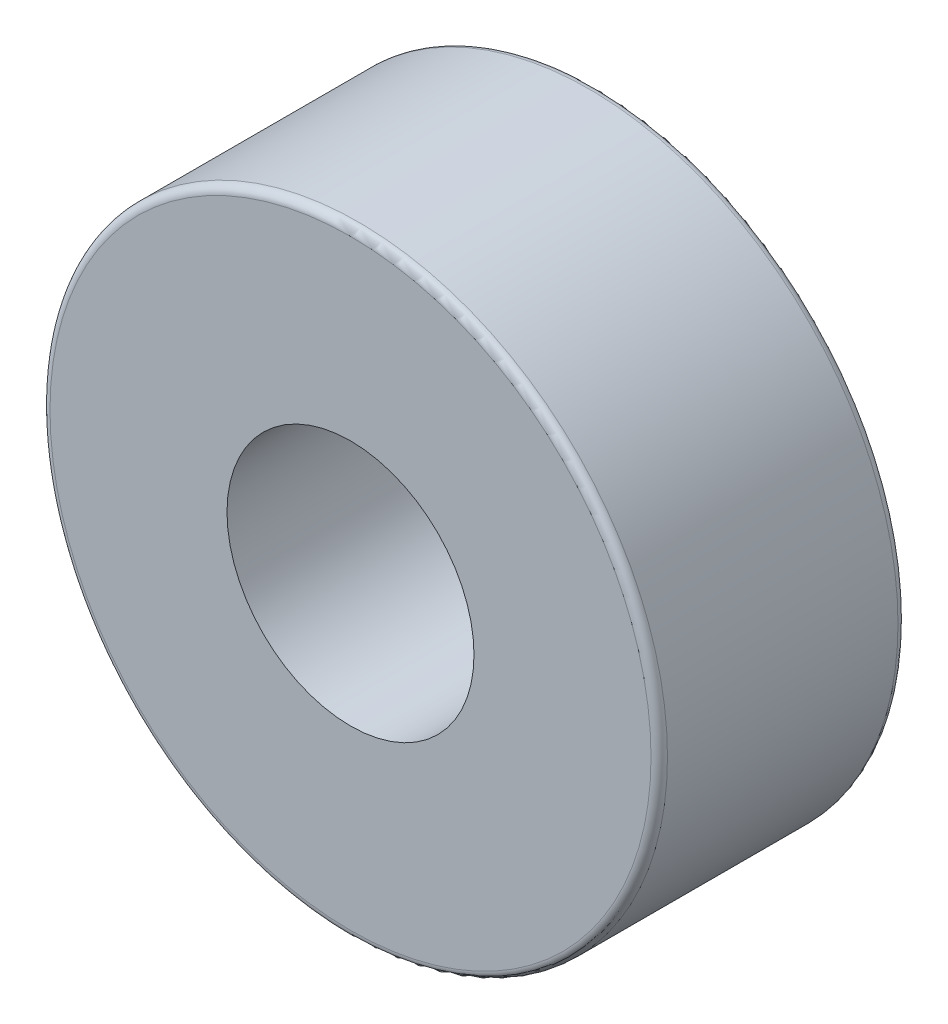
ISO-10303-21;
HEADER;
FILE_DESCRIPTION(('STEP AP214'),'2;1');
FILE_NAME('part.step','',(''),(''),'','','');
FILE_SCHEMA(('AUTOMOTIVE_DESIGN { 1 0 10303 214 1 1 1 1 }'));
ENDSEC;
DATA;
#1=APPLICATION_CONTEXT('core data for automotive mechanical design processes');
#2=APPLICATION_PROTOCOL_DEFINITION('international standard','automotive_design',2000,#1);
#3=PRODUCT_CONTEXT('',#1,'mechanical');
#4=PRODUCT('Part','Part','',(#3));
#5=PRODUCT_RELATED_PRODUCT_CATEGORY('part','',(#4));
#6=PRODUCT_DEFINITION_FORMATION('','',#4);
#7=PRODUCT_DEFINITION_CONTEXT('part definition',#1,'design');
#8=PRODUCT_DEFINITION('design','',#6,#7);
#9=PRODUCT_DEFINITION_SHAPE('','',#8);
#10=(LENGTH_UNIT() NAMED_UNIT(*) SI_UNIT(.MILLI.,.METRE.));
#11=(NAMED_UNIT(*) PLANE_ANGLE_UNIT() SI_UNIT($,.RADIAN.));
#12=(NAMED_UNIT(*) SI_UNIT($,.STERADIAN.) SOLID_ANGLE_UNIT());
#13=UNCERTAINTY_MEASURE_WITH_UNIT(LENGTH_MEASURE(1.E-05),#10,'distance_accuracy_value','');
#14=(GEOMETRIC_REPRESENTATION_CONTEXT(3) GLOBAL_UNCERTAINTY_ASSIGNED_CONTEXT((#13)) GLOBAL_UNIT_ASSIGNED_CONTEXT((#10,
#11,#12)) REPRESENTATION_CONTEXT('',''));
#15=CARTESIAN_POINT('',(0.,0.,0.));
#16=DIRECTION('',(0.,0.,1.));
#17=DIRECTION('',(1.,0.,0.));
#18=AXIS2_PLACEMENT_3D('',#15,#16,#17);
#19=CARTESIAN_POINT('',(0.,0.,6.));
#20=DIRECTION('',(0.,0.,-1.));
#21=DIRECTION('',(-1.,0.,0.));
#22=AXIS2_PLACEMENT_3D('',#19,#20,#21);
#23=CYLINDRICAL_SURFACE('',#22,7.5);
#24=CARTESIAN_POINT('',(0.,0.,0.2));
#25=DIRECTION('',(0.,0.,1.));
#26=DIRECTION('',(1.,0.,0.));
#27=AXIS2_PLACEMENT_3D('',#24,#25,#26);
#28=CIRCLE('',#27,7.5);
#29=CARTESIAN_POINT('',(7.5,0.,0.2));
#30=VERTEX_POINT('',#29);
#31=EDGE_CURVE('E42',#30,#30,#28,.T.);
#32=ORIENTED_EDGE('',*,*,#31,.T.);
#33=EDGE_LOOP('',(#32));
#34=FACE_BOUND('',#33,.T.);
#35=CARTESIAN_POINT('',(0.,0.,5.8));
#36=DIRECTION('',(0.,0.,1.));
#37=DIRECTION('',(1.,0.,0.));
#38=AXIS2_PLACEMENT_3D('',#35,#36,#37);
#39=CIRCLE('',#38,7.5);
#40=CARTESIAN_POINT('',(7.5,0.,5.8));
#41=VERTEX_POINT('',#40);
#42=EDGE_CURVE('E46',#41,#41,#39,.F.);
#43=ORIENTED_EDGE('',*,*,#42,.T.);
#44=EDGE_LOOP('',(#43));
#45=FACE_BOUND('',#44,.T.);
#46=ADVANCED_FACE('F31',(#34,#45),#23,.T.);
#47=CARTESIAN_POINT('',(0.,0.,6.));
#48=DIRECTION('',(0.,0.,1.));
#49=DIRECTION('',(1.,0.,0.));
#50=AXIS2_PLACEMENT_3D('',#47,#48,#49);
#51=PLANE('',#50);
#52=CARTESIAN_POINT('',(0.,0.,6.));
#53=DIRECTION('',(0.,0.,1.));
#54=DIRECTION('',(1.,0.,0.));
#55=AXIS2_PLACEMENT_3D('',#52,#53,#54);
#56=CIRCLE('',#55,7.3);
#57=CARTESIAN_POINT('',(7.3,0.,6.));
#58=VERTEX_POINT('',#57);
#59=EDGE_CURVE('E10',#58,#58,#56,.T.);
#60=ORIENTED_EDGE('',*,*,#59,.T.);
#61=EDGE_LOOP('',(#60));
#62=FACE_BOUND('',#61,.T.);
#63=CARTESIAN_POINT('',(0.,0.,6.));
#64=DIRECTION('',(0.,0.,1.));
#65=DIRECTION('',(1.,0.,0.));
#66=AXIS2_PLACEMENT_3D('',#63,#64,#65);
#67=CIRCLE('',#66,3.);
#68=CARTESIAN_POINT('',(-3.,0.,6.));
#69=VERTEX_POINT('',#68);
#70=EDGE_CURVE('E51',#69,#69,#67,.T.);
#71=ORIENTED_EDGE('',*,*,#70,.F.);
#72=EDGE_LOOP('',(#71));
#73=FACE_BOUND('',#72,.T.);
#74=ADVANCED_FACE('F67',(#62,#73),#51,.T.);
#75=CARTESIAN_POINT('',(0.,0.,0.));
#76=DIRECTION('',(0.,0.,1.));
#77=DIRECTION('',(1.,0.,0.));
#78=AXIS2_PLACEMENT_3D('',#75,#76,#77);
#79=PLANE('',#78);
#80=CARTESIAN_POINT('',(0.,0.,0.));
#81=DIRECTION('',(0.,0.,1.));
#82=DIRECTION('',(1.,0.,0.));
#83=AXIS2_PLACEMENT_3D('',#80,#81,#82);
#84=CIRCLE('',#83,7.3);
#85=CARTESIAN_POINT('',(7.3,0.,0.));
#86=VERTEX_POINT('',#85);
#87=EDGE_CURVE('E38',#86,#86,#84,.F.);
#88=ORIENTED_EDGE('',*,*,#87,.T.);
#89=EDGE_LOOP('',(#88));
#90=FACE_BOUND('',#89,.T.);
#91=CARTESIAN_POINT('',(0.,0.,0.));
#92=DIRECTION('',(0.,0.,1.));
#93=DIRECTION('',(1.,0.,0.));
#94=AXIS2_PLACEMENT_3D('',#91,#92,#93);
#95=CIRCLE('',#94,3.);
#96=CARTESIAN_POINT('',(-3.,0.,0.));
#97=VERTEX_POINT('',#96);
#98=EDGE_CURVE('E54',#97,#97,#95,.T.);
#99=ORIENTED_EDGE('',*,*,#98,.T.);
#100=EDGE_LOOP('',(#99));
#101=FACE_BOUND('',#100,.T.);
#102=ADVANCED_FACE('F58',(#90,#101),#79,.F.);
#103=CARTESIAN_POINT('',(0.,0.,14.4852813742386));
#104=DIRECTION('',(0.,0.,-1.));
#105=DIRECTION('',(-1.,0.,0.));
#106=AXIS2_PLACEMENT_3D('',#103,#104,#105);
#107=CYLINDRICAL_SURFACE('',#106,3.);
#108=CARTESIAN_POINT('',(-3.,0.,0.));
#109=CARTESIAN_POINT('',(-3.,0.,0.0625000000000001));
#110=CARTESIAN_POINT('',(-3.,0.,0.125));
#111=CARTESIAN_POINT('',(-3.,0.,0.25));
#112=CARTESIAN_POINT('',(-3.,0.,0.3125));
#113=CARTESIAN_POINT('',(-3.,0.,0.4375));
#114=CARTESIAN_POINT('',(-3.,0.,0.5));
#115=CARTESIAN_POINT('',(-3.,0.,0.625000000000001));
#116=CARTESIAN_POINT('',(-3.,0.,0.687500000000001));
#117=CARTESIAN_POINT('',(-3.,0.,0.8125));
#118=CARTESIAN_POINT('',(-3.,0.,0.875));
#119=CARTESIAN_POINT('',(-3.,0.,0.999999999999999));
#120=CARTESIAN_POINT('',(-3.,0.,1.0625));
#121=CARTESIAN_POINT('',(-3.,0.,1.1875));
#122=CARTESIAN_POINT('',(-3.,0.,1.25));
#123=CARTESIAN_POINT('',(-3.,0.,1.375));
#124=CARTESIAN_POINT('',(-3.,0.,1.4375));
#125=CARTESIAN_POINT('',(-3.,0.,1.5625));
#126=CARTESIAN_POINT('',(-3.,0.,1.625));
#127=CARTESIAN_POINT('',(-3.,0.,1.75));
#128=CARTESIAN_POINT('',(-3.,0.,1.8125));
#129=CARTESIAN_POINT('',(-3.,0.,1.9375));
#130=CARTESIAN_POINT('',(-3.,0.,2.));
#131=CARTESIAN_POINT('',(-3.,0.,2.125));
#132=CARTESIAN_POINT('',(-3.,0.,2.1875));
#133=CARTESIAN_POINT('',(-3.,0.,2.3125));
#134=CARTESIAN_POINT('',(-3.,0.,2.375));
#135=CARTESIAN_POINT('',(-3.,0.,2.5));
#136=CARTESIAN_POINT('',(-3.,0.,2.5625));
#137=CARTESIAN_POINT('',(-3.,0.,2.6875));
#138=CARTESIAN_POINT('',(-3.,0.,2.75));
#139=CARTESIAN_POINT('',(-3.,0.,2.875));
#140=CARTESIAN_POINT('',(-3.,0.,2.9375));
#141=CARTESIAN_POINT('',(-3.,0.,3.0625));
#142=CARTESIAN_POINT('',(-3.,0.,3.125));
#143=CARTESIAN_POINT('',(-3.,0.,3.25));
#144=CARTESIAN_POINT('',(-3.,0.,3.3125));
#145=CARTESIAN_POINT('',(-3.,0.,3.4375));
#146=CARTESIAN_POINT('',(-3.,0.,3.5));
#147=CARTESIAN_POINT('',(-3.,0.,3.625));
#148=CARTESIAN_POINT('',(-3.,0.,3.6875));
#149=CARTESIAN_POINT('',(-3.,0.,3.8125));
#150=CARTESIAN_POINT('',(-3.,0.,3.875));
#151=CARTESIAN_POINT('',(-3.,0.,4.));
#152=CARTESIAN_POINT('',(-3.,0.,4.0625));
#153=CARTESIAN_POINT('',(-3.,0.,4.1875));
#154=CARTESIAN_POINT('',(-3.,0.,4.25));
#155=CARTESIAN_POINT('',(-3.,0.,4.375));
#156=CARTESIAN_POINT('',(-3.,0.,4.4375));
#157=CARTESIAN_POINT('',(-3.,0.,4.5625));
#158=CARTESIAN_POINT('',(-3.,0.,4.625));
#159=CARTESIAN_POINT('',(-3.,0.,4.75));
#160=CARTESIAN_POINT('',(-3.,0.,4.8125));
#161=CARTESIAN_POINT('',(-3.,0.,4.9375));
#162=CARTESIAN_POINT('',(-3.,0.,5.));
#163=CARTESIAN_POINT('',(-3.,0.,5.125));
#164=CARTESIAN_POINT('',(-3.,0.,5.1875));
#165=CARTESIAN_POINT('',(-3.,0.,5.3125));
#166=CARTESIAN_POINT('',(-3.,0.,5.375));
#167=CARTESIAN_POINT('',(-3.,0.,5.5));
#168=CARTESIAN_POINT('',(-3.,0.,5.5625));
#169=CARTESIAN_POINT('',(-3.,0.,5.6875));
#170=CARTESIAN_POINT('',(-3.,0.,5.75));
#171=CARTESIAN_POINT('',(-3.,0.,5.875));
#172=CARTESIAN_POINT('',(-3.,0.,5.9375));
#173=CARTESIAN_POINT('',(-3.,0.,6.));
#174=B_SPLINE_CURVE_WITH_KNOTS('',3,(#108,#109,#110,#111,#112,#113,#114,#115,#116,#117,#118,
#119,#120,#121,#122,#123,#124,#125,#126,#127,#128,#129,#130,#131,#132,#133,#134,#135,#136,#137,
#138,#139,#140,#141,#142,#143,#144,#145,#146,#147,#148,#149,#150,#151,#152,#153,#154,#155,#156,
#157,#158,#159,#160,#161,#162,#163,#164,#165,#166,#167,#168,#169,#170,#171,#172,#173),
.UNSPECIFIED.,.F.,.F.,(4,2,2,2,2,2,2,2,2,2,2,2,2,2,2,2,2,2,2,2,2,2,2,2,2,2,2,2,2,2,2,2,4),(0.,
0.1875,0.375,0.5625,0.750000000000001,0.937499999999999,1.125,1.3125,1.5,1.6875,1.875,2.0625,
2.25,2.4375,2.625,2.8125,3.,3.1875,3.375,3.5625,3.75,3.9375,4.125,4.3125,4.5,4.6875,4.875,
5.0625,5.25,5.4375,5.625,5.8125,6.),.UNSPECIFIED.);
#175=EDGE_CURVE('BSEAM60',#97,#69,#174,.T.);
#176=ORIENTED_EDGE('',*,*,#98,.F.);
#177=ORIENTED_EDGE('',*,*,#70,.T.);
#178=ORIENTED_EDGE('',*,*,#175,.T.);
#179=ORIENTED_EDGE('',*,*,#175,.F.);
#180=EDGE_LOOP('',(#176,#178,#177,#179));
#181=FACE_BOUND('',#180,.T.);
#182=ADVANCED_FACE('F60',(#181),#107,.F.);
#183=CARTESIAN_POINT('',(0.,0.,0.2));
#184=DIRECTION('',(0.,0.,1.));
#185=DIRECTION('',(1.,0.,0.));
#186=AXIS2_PLACEMENT_3D('',#183,#184,#185);
#187=TOROIDAL_SURFACE('',#186,7.3,0.2);
#188=ORIENTED_EDGE('',*,*,#87,.F.);
#189=EDGE_LOOP('',(#188));
#190=FACE_BOUND('',#189,.T.);
#191=ORIENTED_EDGE('',*,*,#31,.F.);
#192=EDGE_LOOP('',(#191));
#193=FACE_BOUND('',#192,.T.);
#194=ADVANCED_FACE('F63',(#190,#193),#187,.T.);
#195=CARTESIAN_POINT('',(0.,0.,5.8));
#196=DIRECTION('',(0.,0.,1.));
#197=DIRECTION('',(1.,0.,0.));
#198=AXIS2_PLACEMENT_3D('',#195,#196,#197);
#199=TOROIDAL_SURFACE('',#198,7.3,0.2);
#200=ORIENTED_EDGE('',*,*,#42,.F.);
#201=EDGE_LOOP('',(#200));
#202=FACE_BOUND('',#201,.T.);
#203=ORIENTED_EDGE('',*,*,#59,.F.);
#204=EDGE_LOOP('',(#203));
#205=FACE_BOUND('',#204,.T.);
#206=ADVANCED_FACE('F33',(#202,#205),#199,.T.);
#207=CLOSED_SHELL('',(#46,#74,#102,#182,#194,#206));
#208=MANIFOLD_SOLID_BREP('B2',#207);
#209=ADVANCED_BREP_SHAPE_REPRESENTATION('',(#18,#208),#14);
#210=SHAPE_DEFINITION_REPRESENTATION(#9,#209);
ENDSEC;
END-ISO-10303-21;
